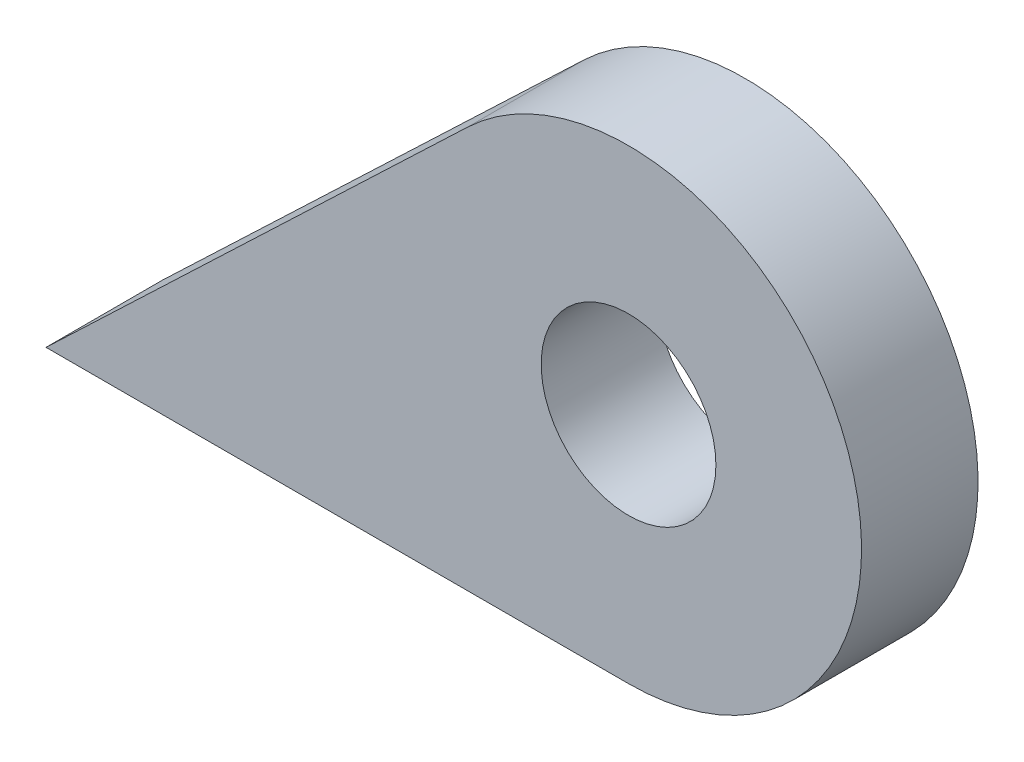
ISO-10303-21;
HEADER;
FILE_DESCRIPTION(('STEP AP214'),'2;1');
FILE_NAME('part.step','',(''),(''),'','','');
FILE_SCHEMA(('AUTOMOTIVE_DESIGN { 1 0 10303 214 1 1 1 1 }'));
ENDSEC;
DATA;
#1=APPLICATION_CONTEXT('core data for automotive mechanical design processes');
#2=APPLICATION_PROTOCOL_DEFINITION('international standard','automotive_design',2000,#1);
#3=PRODUCT_CONTEXT('',#1,'mechanical');
#4=PRODUCT('Part','Part','',(#3));
#5=PRODUCT_RELATED_PRODUCT_CATEGORY('part','',(#4));
#6=PRODUCT_DEFINITION_FORMATION('','',#4);
#7=PRODUCT_DEFINITION_CONTEXT('part definition',#1,'design');
#8=PRODUCT_DEFINITION('design','',#6,#7);
#9=PRODUCT_DEFINITION_SHAPE('','',#8);
#10=(LENGTH_UNIT() NAMED_UNIT(*) SI_UNIT(.MILLI.,.METRE.));
#11=(NAMED_UNIT(*) PLANE_ANGLE_UNIT() SI_UNIT($,.RADIAN.));
#12=(NAMED_UNIT(*) SI_UNIT($,.STERADIAN.) SOLID_ANGLE_UNIT());
#13=UNCERTAINTY_MEASURE_WITH_UNIT(LENGTH_MEASURE(1.E-05),#10,'distance_accuracy_value','');
#14=(GEOMETRIC_REPRESENTATION_CONTEXT(3) GLOBAL_UNCERTAINTY_ASSIGNED_CONTEXT((#13)) GLOBAL_UNIT_ASSIGNED_CONTEXT((#10,
#11,#12)) REPRESENTATION_CONTEXT('',''));
#15=CARTESIAN_POINT('',(0.,0.,0.));
#16=DIRECTION('',(0.,0.,1.));
#17=DIRECTION('',(1.,0.,0.));
#18=AXIS2_PLACEMENT_3D('',#15,#16,#17);
#19=CARTESIAN_POINT('',(0.,-6.35,3.175));
#20=DIRECTION('',(0.,-1.,0.));
#21=DIRECTION('',(1.,0.,0.));
#22=AXIS2_PLACEMENT_3D('',#19,#20,#21);
#23=PLANE('',#22);
#24=DIRECTION('',(-1.,0.,0.));
#25=VECTOR('',#24,1.);
#26=CARTESIAN_POINT('',(0.,-6.35,0.));
#27=LINE('',#26,#25);
#28=CARTESIAN_POINT('',(0.,-6.35,0.));
#29=VERTEX_POINT('',#28);
#30=CARTESIAN_POINT('',(-15.875,-6.35,0.));
#31=VERTEX_POINT('',#30);
#32=EDGE_CURVE('E69',#29,#31,#27,.T.);
#33=ORIENTED_EDGE('',*,*,#32,.F.);
#34=DIRECTION('',(0.,0.,-1.));
#35=VECTOR('',#34,1.);
#36=CARTESIAN_POINT('',(0.,-6.35,3.175));
#37=LINE('',#36,#35);
#38=CARTESIAN_POINT('',(0.,-6.35,3.175));
#39=VERTEX_POINT('',#38);
#40=EDGE_CURVE('E11',#39,#29,#37,.T.);
#41=ORIENTED_EDGE('',*,*,#40,.F.);
#42=DIRECTION('',(-1.,0.,0.));
#43=VECTOR('',#42,1.);
#44=CARTESIAN_POINT('',(0.,-6.35,3.175));
#45=LINE('',#44,#43);
#46=CARTESIAN_POINT('',(-15.875,-6.35,3.175));
#47=VERTEX_POINT('',#46);
#48=EDGE_CURVE('E67',#39,#47,#45,.T.);
#49=ORIENTED_EDGE('',*,*,#48,.T.);
#50=DIRECTION('',(0.,0.,-1.));
#51=VECTOR('',#50,1.);
#52=CARTESIAN_POINT('',(-15.875,-6.35,3.175));
#53=LINE('',#52,#51);
#54=EDGE_CURVE('E49',#47,#31,#53,.T.);
#55=ORIENTED_EDGE('',*,*,#54,.T.);
#56=EDGE_LOOP('',(#33,#41,#49,#55));
#57=FACE_BOUND('',#56,.T.);
#58=ADVANCED_FACE('F33',(#57),#23,.T.);
#59=CARTESIAN_POINT('',(0.,0.,3.175));
#60=DIRECTION('',(0.,0.,-1.));
#61=DIRECTION('',(-1.,0.,0.));
#62=AXIS2_PLACEMENT_3D('',#59,#60,#61);
#63=CYLINDRICAL_SURFACE('',#62,6.35);
#64=CARTESIAN_POINT('',(0.,0.,0.));
#65=DIRECTION('',(0.,0.,1.));
#66=DIRECTION('',(1.,0.,0.));
#67=AXIS2_PLACEMENT_3D('',#64,#65,#66);
#68=CIRCLE('',#67,6.35);
#69=CARTESIAN_POINT('',(-4.37931034482759,4.59827586206897,0.));
#70=VERTEX_POINT('',#69);
#71=EDGE_CURVE('E90',#29,#70,#68,.T.);
#72=ORIENTED_EDGE('',*,*,#71,.T.);
#73=DIRECTION('',(0.,0.,-1.));
#74=VECTOR('',#73,1.);
#75=CARTESIAN_POINT('',(-4.37931034482759,4.59827586206897,3.175));
#76=LINE('',#75,#74);
#77=CARTESIAN_POINT('',(-4.37931034482759,4.59827586206897,3.175));
#78=VERTEX_POINT('',#77);
#79=EDGE_CURVE('E41',#78,#70,#76,.T.);
#80=ORIENTED_EDGE('',*,*,#79,.F.);
#81=CARTESIAN_POINT('',(0.,0.,3.175));
#82=DIRECTION('',(0.,0.,1.));
#83=DIRECTION('',(1.,0.,0.));
#84=AXIS2_PLACEMENT_3D('',#81,#82,#83);
#85=CIRCLE('',#84,6.35);
#86=EDGE_CURVE('E72',#39,#78,#85,.T.);
#87=ORIENTED_EDGE('',*,*,#86,.F.);
#88=ORIENTED_EDGE('',*,*,#40,.T.);
#89=EDGE_LOOP('',(#72,#80,#87,#88));
#90=FACE_BOUND('',#89,.T.);
#91=ADVANCED_FACE('F73',(#90),#63,.T.);
#92=CARTESIAN_POINT('',(-4.37931034482759,4.59827586206897,3.175));
#93=DIRECTION('',(-0.689655172413793,0.724137931034483,0.));
#94=DIRECTION('',(-0.724137931034483,-0.689655172413793,0.));
#95=AXIS2_PLACEMENT_3D('',#92,#93,#94);
#96=PLANE('',#95);
#97=DIRECTION('',(0.724137931034483,0.689655172413793,0.));
#98=VECTOR('',#97,1.);
#99=CARTESIAN_POINT('',(-4.37931034482759,4.59827586206897,0.));
#100=LINE('',#99,#98);
#101=EDGE_CURVE('E82',#31,#70,#100,.T.);
#102=ORIENTED_EDGE('',*,*,#101,.F.);
#103=ORIENTED_EDGE('',*,*,#54,.F.);
#104=DIRECTION('',(0.724137931034483,0.689655172413793,0.));
#105=VECTOR('',#104,1.);
#106=CARTESIAN_POINT('',(-4.37931034482759,4.59827586206897,3.175));
#107=LINE('',#106,#105);
#108=EDGE_CURVE('E75',#47,#78,#107,.T.);
#109=ORIENTED_EDGE('',*,*,#108,.T.);
#110=ORIENTED_EDGE('',*,*,#79,.T.);
#111=EDGE_LOOP('',(#102,#103,#109,#110));
#112=FACE_BOUND('',#111,.T.);
#113=ADVANCED_FACE('F97',(#112),#96,.T.);
#114=CARTESIAN_POINT('',(0.,0.,3.175));
#115=DIRECTION('',(0.,0.,-1.));
#116=DIRECTION('',(-1.,0.,0.));
#117=AXIS2_PLACEMENT_3D('',#114,#115,#116);
#118=CYLINDRICAL_SURFACE('',#117,2.38125);
#119=CARTESIAN_POINT('',(0.,0.,3.175));
#120=DIRECTION('',(0.,0.,1.));
#121=DIRECTION('',(1.,0.,0.));
#122=AXIS2_PLACEMENT_3D('',#119,#120,#121);
#123=CIRCLE('',#122,2.38125);
#124=CARTESIAN_POINT('',(2.38125,0.,3.175));
#125=VERTEX_POINT('',#124);
#126=EDGE_CURVE('E86',#125,#125,#123,.T.);
#127=ORIENTED_EDGE('',*,*,#126,.T.);
#128=EDGE_LOOP('',(#127));
#129=FACE_BOUND('',#128,.T.);
#130=CARTESIAN_POINT('',(0.,0.,0.));
#131=DIRECTION('',(0.,0.,1.));
#132=DIRECTION('',(1.,0.,0.));
#133=AXIS2_PLACEMENT_3D('',#130,#131,#132);
#134=CIRCLE('',#133,2.38125);
#135=CARTESIAN_POINT('',(2.38125,0.,0.));
#136=VERTEX_POINT('',#135);
#137=EDGE_CURVE('E79',#136,#136,#134,.T.);
#138=ORIENTED_EDGE('',*,*,#137,.F.);
#139=EDGE_LOOP('',(#138));
#140=FACE_BOUND('',#139,.T.);
#141=ADVANCED_FACE('F99',(#129,#140),#118,.F.);
#142=CARTESIAN_POINT('',(0.,0.,3.175));
#143=DIRECTION('',(0.,0.,1.));
#144=DIRECTION('',(1.,0.,0.));
#145=AXIS2_PLACEMENT_3D('',#142,#143,#144);
#146=PLANE('',#145);
#147=ORIENTED_EDGE('',*,*,#48,.F.);
#148=ORIENTED_EDGE('',*,*,#86,.T.);
#149=ORIENTED_EDGE('',*,*,#108,.F.);
#150=EDGE_LOOP('',(#147,#148,#149));
#151=FACE_BOUND('',#150,.T.);
#152=ORIENTED_EDGE('',*,*,#126,.F.);
#153=EDGE_LOOP('',(#152));
#154=FACE_BOUND('',#153,.T.);
#155=ADVANCED_FACE('F77',(#151,#154),#146,.T.);
#156=CARTESIAN_POINT('',(0.,0.,0.));
#157=DIRECTION('',(0.,0.,1.));
#158=DIRECTION('',(1.,0.,0.));
#159=AXIS2_PLACEMENT_3D('',#156,#157,#158);
#160=PLANE('',#159);
#161=ORIENTED_EDGE('',*,*,#32,.T.);
#162=ORIENTED_EDGE('',*,*,#101,.T.);
#163=ORIENTED_EDGE('',*,*,#71,.F.);
#164=EDGE_LOOP('',(#161,#162,#163));
#165=FACE_BOUND('',#164,.T.);
#166=ORIENTED_EDGE('',*,*,#137,.T.);
#167=EDGE_LOOP('',(#166));
#168=FACE_BOUND('',#167,.T.);
#169=ADVANCED_FACE('F95',(#165,#168),#160,.F.);
#170=CLOSED_SHELL('',(#58,#91,#113,#141,#155,#169));
#171=MANIFOLD_SOLID_BREP('B2',#170);
#172=ADVANCED_BREP_SHAPE_REPRESENTATION('',(#18,#171),#14);
#173=SHAPE_DEFINITION_REPRESENTATION(#9,#172);
ENDSEC;
END-ISO-10303-21;
